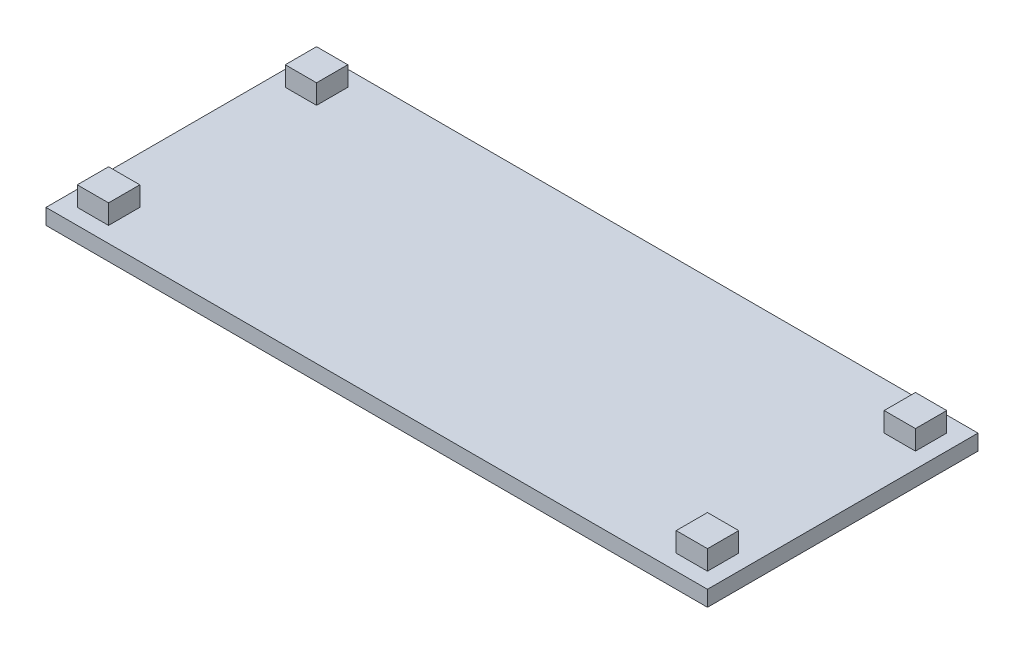
ISO-10303-21;
HEADER;
FILE_DESCRIPTION(('STEP AP214'),'2;1');
FILE_NAME('part.step','',(''),(''),'','','');
FILE_SCHEMA(('AUTOMOTIVE_DESIGN { 1 0 10303 214 1 1 1 1 }'));
ENDSEC;
DATA;
#1=APPLICATION_CONTEXT('core data for automotive mechanical design processes');
#2=APPLICATION_PROTOCOL_DEFINITION('international standard','automotive_design',2000,#1);
#3=PRODUCT_CONTEXT('',#1,'mechanical');
#4=PRODUCT('Part','Part','',(#3));
#5=PRODUCT_RELATED_PRODUCT_CATEGORY('part','',(#4));
#6=PRODUCT_DEFINITION_FORMATION('','',#4);
#7=PRODUCT_DEFINITION_CONTEXT('part definition',#1,'design');
#8=PRODUCT_DEFINITION('design','',#6,#7);
#9=PRODUCT_DEFINITION_SHAPE('','',#8);
#10=(LENGTH_UNIT() NAMED_UNIT(*) SI_UNIT(.MILLI.,.METRE.));
#11=(NAMED_UNIT(*) PLANE_ANGLE_UNIT() SI_UNIT($,.RADIAN.));
#12=(NAMED_UNIT(*) SI_UNIT($,.STERADIAN.) SOLID_ANGLE_UNIT());
#13=UNCERTAINTY_MEASURE_WITH_UNIT(LENGTH_MEASURE(1.E-05),#10,'distance_accuracy_value','');
#14=(GEOMETRIC_REPRESENTATION_CONTEXT(3) GLOBAL_UNCERTAINTY_ASSIGNED_CONTEXT((#13)) GLOBAL_UNIT_ASSIGNED_CONTEXT((#10,
#11,#12)) REPRESENTATION_CONTEXT('',''));
#15=CARTESIAN_POINT('',(0.,0.,0.));
#16=DIRECTION('',(0.,0.,1.));
#17=DIRECTION('',(1.,0.,0.));
#18=AXIS2_PLACEMENT_3D('',#15,#16,#17);
#19=CARTESIAN_POINT('',(0.,2.,0.));
#20=DIRECTION('',(0.,-1.,0.));
#21=DIRECTION('',(0.,0.,-1.));
#22=AXIS2_PLACEMENT_3D('',#19,#20,#21);
#23=PLANE('',#22);
#24=DIRECTION('',(0.,0.,-1.));
#25=VECTOR('',#24,1.);
#26=CARTESIAN_POINT('',(-36.3,2.,0.));
#27=LINE('',#26,#25);
#28=CARTESIAN_POINT('',(-36.3,2.,-11.3));
#29=VERTEX_POINT('',#28);
#30=CARTESIAN_POINT('',(-36.3,2.,-15.3));
#31=VERTEX_POINT('',#30);
#32=EDGE_CURVE('E297',#29,#31,#27,.T.);
#33=ORIENTED_EDGE('',*,*,#32,.F.);
#34=DIRECTION('',(1.,0.,0.));
#35=VECTOR('',#34,1.);
#36=CARTESIAN_POINT('',(0.,2.,-11.3));
#37=LINE('',#36,#35);
#38=CARTESIAN_POINT('',(-40.3,2.,-11.3));
#39=VERTEX_POINT('',#38);
#40=EDGE_CURVE('E288',#39,#29,#37,.T.);
#41=ORIENTED_EDGE('',*,*,#40,.F.);
#42=DIRECTION('',(0.,0.,1.));
#43=VECTOR('',#42,1.);
#44=CARTESIAN_POINT('',(-40.3,2.,0.));
#45=LINE('',#44,#43);
#46=CARTESIAN_POINT('',(-40.3,2.,-15.3));
#47=VERTEX_POINT('',#46);
#48=EDGE_CURVE('E295',#47,#39,#45,.T.);
#49=ORIENTED_EDGE('',*,*,#48,.F.);
#50=DIRECTION('',(-1.,0.,0.));
#51=VECTOR('',#50,1.);
#52=CARTESIAN_POINT('',(0.,2.,-15.3));
#53=LINE('',#52,#51);
#54=EDGE_CURVE('E293',#31,#47,#53,.T.);
#55=ORIENTED_EDGE('',*,*,#54,.F.);
#56=EDGE_LOOP('',(#33,#41,#49,#55));
#57=FACE_BOUND('',#56,.T.);
#58=DIRECTION('',(0.,0.,1.));
#59=VECTOR('',#58,1.);
#60=CARTESIAN_POINT('',(36.3,2.,0.));
#61=LINE('',#60,#59);
#62=CARTESIAN_POINT('',(36.3,2.,-15.3));
#63=VERTEX_POINT('',#62);
#64=CARTESIAN_POINT('',(36.3,2.,-11.3));
#65=VERTEX_POINT('',#64);
#66=EDGE_CURVE('E280',#63,#65,#61,.T.);
#67=ORIENTED_EDGE('',*,*,#66,.F.);
#68=DIRECTION('',(-1.,0.,0.));
#69=VECTOR('',#68,1.);
#70=CARTESIAN_POINT('',(0.,2.,-15.3));
#71=LINE('',#70,#69);
#72=CARTESIAN_POINT('',(40.3,2.,-15.3));
#73=VERTEX_POINT('',#72);
#74=EDGE_CURVE('E268',#73,#63,#71,.T.);
#75=ORIENTED_EDGE('',*,*,#74,.F.);
#76=DIRECTION('',(0.,0.,-1.));
#77=VECTOR('',#76,1.);
#78=CARTESIAN_POINT('',(40.3,2.,0.));
#79=LINE('',#78,#77);
#80=CARTESIAN_POINT('',(40.3,2.,-11.3));
#81=VERTEX_POINT('',#80);
#82=EDGE_CURVE('E271',#81,#73,#79,.T.);
#83=ORIENTED_EDGE('',*,*,#82,.F.);
#84=DIRECTION('',(1.,0.,0.));
#85=VECTOR('',#84,1.);
#86=CARTESIAN_POINT('',(0.,2.,-11.3));
#87=LINE('',#86,#85);
#88=EDGE_CURVE('E273',#65,#81,#87,.T.);
#89=ORIENTED_EDGE('',*,*,#88,.F.);
#90=EDGE_LOOP('',(#67,#75,#83,#89));
#91=FACE_BOUND('',#90,.T.);
#92=DIRECTION('',(0.,0.,-1.));
#93=VECTOR('',#92,1.);
#94=CARTESIAN_POINT('',(42.3,2.,17.3));
#95=LINE('',#94,#93);
#96=CARTESIAN_POINT('',(42.3,2.,17.3));
#97=VERTEX_POINT('',#96);
#98=CARTESIAN_POINT('',(42.3,2.,-17.3));
#99=VERTEX_POINT('',#98);
#100=EDGE_CURVE('E310',#97,#99,#95,.T.);
#101=ORIENTED_EDGE('',*,*,#100,.T.);
#102=DIRECTION('',(-1.,0.,0.));
#103=VECTOR('',#102,1.);
#104=CARTESIAN_POINT('',(-42.3,2.,-17.3));
#105=LINE('',#104,#103);
#106=CARTESIAN_POINT('',(-42.3,2.,-17.3));
#107=VERTEX_POINT('',#106);
#108=EDGE_CURVE('E315',#99,#107,#105,.T.);
#109=ORIENTED_EDGE('',*,*,#108,.T.);
#110=DIRECTION('',(0.,0.,1.));
#111=VECTOR('',#110,1.);
#112=CARTESIAN_POINT('',(-42.3,2.,17.3));
#113=LINE('',#112,#111);
#114=CARTESIAN_POINT('',(-42.3,2.,17.3));
#115=VERTEX_POINT('',#114);
#116=EDGE_CURVE('E312',#107,#115,#113,.T.);
#117=ORIENTED_EDGE('',*,*,#116,.T.);
#118=DIRECTION('',(1.,0.,0.));
#119=VECTOR('',#118,1.);
#120=CARTESIAN_POINT('',(-42.3,2.,17.3));
#121=LINE('',#120,#119);
#122=EDGE_CURVE('E320',#115,#97,#121,.T.);
#123=ORIENTED_EDGE('',*,*,#122,.T.);
#124=EDGE_LOOP('',(#101,#109,#117,#123));
#125=FACE_BOUND('',#124,.T.);
#126=DIRECTION('',(0.,0.,-1.));
#127=VECTOR('',#126,1.);
#128=CARTESIAN_POINT('',(-36.3,2.,0.));
#129=LINE('',#128,#127);
#130=CARTESIAN_POINT('',(-36.3,2.,15.3));
#131=VERTEX_POINT('',#130);
#132=CARTESIAN_POINT('',(-36.3,2.,11.3));
#133=VERTEX_POINT('',#132);
#134=EDGE_CURVE('E290',#131,#133,#129,.T.);
#135=ORIENTED_EDGE('',*,*,#134,.F.);
#136=DIRECTION('',(1.,0.,0.));
#137=VECTOR('',#136,1.);
#138=CARTESIAN_POINT('',(0.,2.,15.3));
#139=LINE('',#138,#137);
#140=CARTESIAN_POINT('',(-40.3,2.,15.3));
#141=VERTEX_POINT('',#140);
#142=EDGE_CURVE('E195',#141,#131,#139,.T.);
#143=ORIENTED_EDGE('',*,*,#142,.F.);
#144=DIRECTION('',(0.,0.,1.));
#145=VECTOR('',#144,1.);
#146=CARTESIAN_POINT('',(-40.3,2.,0.));
#147=LINE('',#146,#145);
#148=CARTESIAN_POINT('',(-40.3,2.,11.3));
#149=VERTEX_POINT('',#148);
#150=EDGE_CURVE('E283',#149,#141,#147,.T.);
#151=ORIENTED_EDGE('',*,*,#150,.F.);
#152=DIRECTION('',(-1.,0.,0.));
#153=VECTOR('',#152,1.);
#154=CARTESIAN_POINT('',(0.,2.,11.3));
#155=LINE('',#154,#153);
#156=EDGE_CURVE('E285',#133,#149,#155,.T.);
#157=ORIENTED_EDGE('',*,*,#156,.F.);
#158=EDGE_LOOP('',(#135,#143,#151,#157));
#159=FACE_BOUND('',#158,.T.);
#160=DIRECTION('',(0.,0.,1.));
#161=VECTOR('',#160,1.);
#162=CARTESIAN_POINT('',(36.3,2.,0.));
#163=LINE('',#162,#161);
#164=CARTESIAN_POINT('',(36.3,2.,11.3));
#165=VERTEX_POINT('',#164);
#166=CARTESIAN_POINT('',(36.3,2.,15.3));
#167=VERTEX_POINT('',#166);
#168=EDGE_CURVE('E308',#165,#167,#163,.T.);
#169=ORIENTED_EDGE('',*,*,#168,.F.);
#170=DIRECTION('',(-1.,0.,0.));
#171=VECTOR('',#170,1.);
#172=CARTESIAN_POINT('',(0.,2.,11.3));
#173=LINE('',#172,#171);
#174=CARTESIAN_POINT('',(40.3,2.,11.3));
#175=VERTEX_POINT('',#174);
#176=EDGE_CURVE('E301',#175,#165,#173,.T.);
#177=ORIENTED_EDGE('',*,*,#176,.F.);
#178=DIRECTION('',(0.,0.,-1.));
#179=VECTOR('',#178,1.);
#180=CARTESIAN_POINT('',(40.3,2.,0.));
#181=LINE('',#180,#179);
#182=CARTESIAN_POINT('',(40.3,2.,15.3));
#183=VERTEX_POINT('',#182);
#184=EDGE_CURVE('E63',#183,#175,#181,.T.);
#185=ORIENTED_EDGE('',*,*,#184,.F.);
#186=DIRECTION('',(1.,0.,0.));
#187=VECTOR('',#186,1.);
#188=CARTESIAN_POINT('',(0.,2.,15.3));
#189=LINE('',#188,#187);
#190=EDGE_CURVE('E57',#167,#183,#189,.T.);
#191=ORIENTED_EDGE('',*,*,#190,.F.);
#192=EDGE_LOOP('',(#169,#177,#185,#191));
#193=FACE_BOUND('',#192,.T.);
#194=ADVANCED_FACE('F41',(#57,#91,#125,#159,#193),#23,.F.);
#195=CARTESIAN_POINT('',(42.3,2.,17.3));
#196=DIRECTION('',(-1.,0.,0.));
#197=DIRECTION('',(0.,0.,1.));
#198=AXIS2_PLACEMENT_3D('',#195,#196,#197);
#199=PLANE('',#198);
#200=DIRECTION('',(0.,0.,-1.));
#201=VECTOR('',#200,1.);
#202=CARTESIAN_POINT('',(42.3,0.,17.3));
#203=LINE('',#202,#201);
#204=CARTESIAN_POINT('',(42.3,0.,17.3));
#205=VERTEX_POINT('',#204);
#206=CARTESIAN_POINT('',(42.3,0.,-17.3));
#207=VERTEX_POINT('',#206);
#208=EDGE_CURVE('E306',#205,#207,#203,.T.);
#209=ORIENTED_EDGE('',*,*,#208,.T.);
#210=DIRECTION('',(0.,-1.,0.));
#211=VECTOR('',#210,1.);
#212=CARTESIAN_POINT('',(42.3,2.,-17.3));
#213=LINE('',#212,#211);
#214=EDGE_CURVE('E11',#99,#207,#213,.T.);
#215=ORIENTED_EDGE('',*,*,#214,.F.);
#216=ORIENTED_EDGE('',*,*,#100,.F.);
#217=DIRECTION('',(0.,-1.,0.));
#218=VECTOR('',#217,1.);
#219=CARTESIAN_POINT('',(42.3,2.,17.3));
#220=LINE('',#219,#218);
#221=EDGE_CURVE('E317',#97,#205,#220,.T.);
#222=ORIENTED_EDGE('',*,*,#221,.T.);
#223=EDGE_LOOP('',(#209,#215,#216,#222));
#224=FACE_BOUND('',#223,.T.);
#225=ADVANCED_FACE('F43',(#224),#199,.F.);
#226=CARTESIAN_POINT('',(-42.3,2.,-17.3));
#227=DIRECTION('',(0.,0.,1.));
#228=DIRECTION('',(1.,0.,0.));
#229=AXIS2_PLACEMENT_3D('',#226,#227,#228);
#230=PLANE('',#229);
#231=DIRECTION('',(-1.,0.,0.));
#232=VECTOR('',#231,1.);
#233=CARTESIAN_POINT('',(-42.3,0.,-17.3));
#234=LINE('',#233,#232);
#235=CARTESIAN_POINT('',(-42.3,0.,-17.3));
#236=VERTEX_POINT('',#235);
#237=EDGE_CURVE('E325',#207,#236,#234,.T.);
#238=ORIENTED_EDGE('',*,*,#237,.T.);
#239=DIRECTION('',(0.,-1.,0.));
#240=VECTOR('',#239,1.);
#241=CARTESIAN_POINT('',(-42.3,2.,-17.3));
#242=LINE('',#241,#240);
#243=EDGE_CURVE('E47',#107,#236,#242,.T.);
#244=ORIENTED_EDGE('',*,*,#243,.F.);
#245=ORIENTED_EDGE('',*,*,#108,.F.);
#246=ORIENTED_EDGE('',*,*,#214,.T.);
#247=EDGE_LOOP('',(#238,#244,#245,#246));
#248=FACE_BOUND('',#247,.T.);
#249=ADVANCED_FACE('F354',(#248),#230,.F.);
#250=CARTESIAN_POINT('',(-42.3,2.,17.3));
#251=DIRECTION('',(1.,0.,0.));
#252=DIRECTION('',(0.,0.,-1.));
#253=AXIS2_PLACEMENT_3D('',#250,#251,#252);
#254=PLANE('',#253);
#255=DIRECTION('',(0.,0.,1.));
#256=VECTOR('',#255,1.);
#257=CARTESIAN_POINT('',(-42.3,0.,17.3));
#258=LINE('',#257,#256);
#259=CARTESIAN_POINT('',(-42.3,0.,17.3));
#260=VERTEX_POINT('',#259);
#261=EDGE_CURVE('E322',#236,#260,#258,.T.);
#262=ORIENTED_EDGE('',*,*,#261,.T.);
#263=DIRECTION('',(0.,-1.,0.));
#264=VECTOR('',#263,1.);
#265=CARTESIAN_POINT('',(-42.3,2.,17.3));
#266=LINE('',#265,#264);
#267=EDGE_CURVE('E328',#115,#260,#266,.T.);
#268=ORIENTED_EDGE('',*,*,#267,.F.);
#269=ORIENTED_EDGE('',*,*,#116,.F.);
#270=ORIENTED_EDGE('',*,*,#243,.T.);
#271=EDGE_LOOP('',(#262,#268,#269,#270));
#272=FACE_BOUND('',#271,.T.);
#273=ADVANCED_FACE('F338',(#272),#254,.F.);
#274=CARTESIAN_POINT('',(-42.3,2.,17.3));
#275=DIRECTION('',(0.,0.,-1.));
#276=DIRECTION('',(-1.,0.,0.));
#277=AXIS2_PLACEMENT_3D('',#274,#275,#276);
#278=PLANE('',#277);
#279=DIRECTION('',(1.,0.,0.));
#280=VECTOR('',#279,1.);
#281=CARTESIAN_POINT('',(-42.3,0.,17.3));
#282=LINE('',#281,#280);
#283=EDGE_CURVE('E311',#260,#205,#282,.T.);
#284=ORIENTED_EDGE('',*,*,#283,.T.);
#285=ORIENTED_EDGE('',*,*,#221,.F.);
#286=ORIENTED_EDGE('',*,*,#122,.F.);
#287=ORIENTED_EDGE('',*,*,#267,.T.);
#288=EDGE_LOOP('',(#284,#285,#286,#287));
#289=FACE_BOUND('',#288,.T.);
#290=ADVANCED_FACE('F344',(#289),#278,.F.);
#291=CARTESIAN_POINT('',(0.,0.,0.));
#292=DIRECTION('',(0.,-1.,0.));
#293=DIRECTION('',(0.,0.,-1.));
#294=AXIS2_PLACEMENT_3D('',#291,#292,#293);
#295=PLANE('',#294);
#296=ORIENTED_EDGE('',*,*,#208,.F.);
#297=ORIENTED_EDGE('',*,*,#283,.F.);
#298=ORIENTED_EDGE('',*,*,#261,.F.);
#299=ORIENTED_EDGE('',*,*,#237,.F.);
#300=EDGE_LOOP('',(#296,#297,#298,#299));
#301=FACE_BOUND('',#300,.T.);
#302=ADVANCED_FACE('F345',(#301),#295,.T.);
#303=CARTESIAN_POINT('',(36.3,4.5,-11.3));
#304=DIRECTION('',(1.,0.,0.));
#305=DIRECTION('',(0.,0.,-1.));
#306=AXIS2_PLACEMENT_3D('',#303,#304,#305);
#307=PLANE('',#306);
#308=DIRECTION('',(0.,-1.,0.));
#309=VECTOR('',#308,1.);
#310=CARTESIAN_POINT('',(36.3,4.5,-15.3));
#311=LINE('',#310,#309);
#312=CARTESIAN_POINT('',(36.3,4.5,-15.3));
#313=VERTEX_POINT('',#312);
#314=EDGE_CURVE('E258',#313,#63,#311,.T.);
#315=ORIENTED_EDGE('',*,*,#314,.T.);
#316=ORIENTED_EDGE('',*,*,#66,.T.);
#317=DIRECTION('',(0.,-1.,0.));
#318=VECTOR('',#317,1.);
#319=CARTESIAN_POINT('',(36.3,4.5,-11.3));
#320=LINE('',#319,#318);
#321=CARTESIAN_POINT('',(36.3,4.5,-11.3));
#322=VERTEX_POINT('',#321);
#323=EDGE_CURVE('E264',#322,#65,#320,.T.);
#324=ORIENTED_EDGE('',*,*,#323,.F.);
#325=DIRECTION('',(0.,0.,1.));
#326=VECTOR('',#325,1.);
#327=CARTESIAN_POINT('',(36.3,4.5,-11.3));
#328=LINE('',#327,#326);
#329=EDGE_CURVE('E226',#313,#322,#328,.T.);
#330=ORIENTED_EDGE('',*,*,#329,.F.);
#331=EDGE_LOOP('',(#315,#316,#324,#330));
#332=FACE_BOUND('',#331,.T.);
#333=ADVANCED_FACE('F369',(#332),#307,.F.);
#334=CARTESIAN_POINT('',(36.3,4.5,-11.3));
#335=DIRECTION('',(0.,0.,-1.));
#336=DIRECTION('',(-1.,0.,0.));
#337=AXIS2_PLACEMENT_3D('',#334,#335,#336);
#338=PLANE('',#337);
#339=ORIENTED_EDGE('',*,*,#323,.T.);
#340=ORIENTED_EDGE('',*,*,#88,.T.);
#341=DIRECTION('',(0.,-1.,0.));
#342=VECTOR('',#341,1.);
#343=CARTESIAN_POINT('',(40.3,4.5,-11.3));
#344=LINE('',#343,#342);
#345=CARTESIAN_POINT('',(40.3,4.5,-11.3));
#346=VERTEX_POINT('',#345);
#347=EDGE_CURVE('E265',#346,#81,#344,.T.);
#348=ORIENTED_EDGE('',*,*,#347,.F.);
#349=DIRECTION('',(1.,0.,0.));
#350=VECTOR('',#349,1.);
#351=CARTESIAN_POINT('',(36.3,4.5,-11.3));
#352=LINE('',#351,#350);
#353=EDGE_CURVE('E249',#322,#346,#352,.T.);
#354=ORIENTED_EDGE('',*,*,#353,.F.);
#355=EDGE_LOOP('',(#339,#340,#348,#354));
#356=FACE_BOUND('',#355,.T.);
#357=ADVANCED_FACE('F407',(#356),#338,.F.);
#358=CARTESIAN_POINT('',(40.3,4.5,-11.3));
#359=DIRECTION('',(-1.,0.,0.));
#360=DIRECTION('',(0.,0.,1.));
#361=AXIS2_PLACEMENT_3D('',#358,#359,#360);
#362=PLANE('',#361);
#363=ORIENTED_EDGE('',*,*,#347,.T.);
#364=ORIENTED_EDGE('',*,*,#82,.T.);
#365=DIRECTION('',(0.,-1.,0.));
#366=VECTOR('',#365,1.);
#367=CARTESIAN_POINT('',(40.3,4.5,-15.3));
#368=LINE('',#367,#366);
#369=CARTESIAN_POINT('',(40.3,4.5,-15.3));
#370=VERTEX_POINT('',#369);
#371=EDGE_CURVE('E259',#370,#73,#368,.T.);
#372=ORIENTED_EDGE('',*,*,#371,.F.);
#373=DIRECTION('',(0.,0.,-1.));
#374=VECTOR('',#373,1.);
#375=CARTESIAN_POINT('',(40.3,4.5,-11.3));
#376=LINE('',#375,#374);
#377=EDGE_CURVE('E252',#346,#370,#376,.T.);
#378=ORIENTED_EDGE('',*,*,#377,.F.);
#379=EDGE_LOOP('',(#363,#364,#372,#378));
#380=FACE_BOUND('',#379,.T.);
#381=ADVANCED_FACE('F418',(#380),#362,.F.);
#382=CARTESIAN_POINT('',(36.3,4.5,-15.3));
#383=DIRECTION('',(0.,0.,1.));
#384=DIRECTION('',(1.,0.,0.));
#385=AXIS2_PLACEMENT_3D('',#382,#383,#384);
#386=PLANE('',#385);
#387=ORIENTED_EDGE('',*,*,#371,.T.);
#388=ORIENTED_EDGE('',*,*,#74,.T.);
#389=ORIENTED_EDGE('',*,*,#314,.F.);
#390=DIRECTION('',(-1.,0.,0.));
#391=VECTOR('',#390,1.);
#392=CARTESIAN_POINT('',(36.3,4.5,-15.3));
#393=LINE('',#392,#391);
#394=EDGE_CURVE('E255',#370,#313,#393,.T.);
#395=ORIENTED_EDGE('',*,*,#394,.F.);
#396=EDGE_LOOP('',(#387,#388,#389,#395));
#397=FACE_BOUND('',#396,.T.);
#398=ADVANCED_FACE('F424',(#397),#386,.F.);
#399=CARTESIAN_POINT('',(0.,4.5,0.));
#400=DIRECTION('',(0.,-1.,0.));
#401=DIRECTION('',(0.,0.,-1.));
#402=AXIS2_PLACEMENT_3D('',#399,#400,#401);
#403=PLANE('',#402);
#404=ORIENTED_EDGE('',*,*,#329,.T.);
#405=ORIENTED_EDGE('',*,*,#353,.T.);
#406=ORIENTED_EDGE('',*,*,#377,.T.);
#407=ORIENTED_EDGE('',*,*,#394,.T.);
#408=EDGE_LOOP('',(#404,#405,#406,#407));
#409=FACE_BOUND('',#408,.T.);
#410=ADVANCED_FACE('F433',(#409),#403,.F.);
#411=CARTESIAN_POINT('',(-36.3,4.5,11.3));
#412=DIRECTION('',(-1.,0.,0.));
#413=DIRECTION('',(0.,0.,1.));
#414=AXIS2_PLACEMENT_3D('',#411,#412,#413);
#415=PLANE('',#414);
#416=DIRECTION('',(0.,-1.,0.));
#417=VECTOR('',#416,1.);
#418=CARTESIAN_POINT('',(-36.3,4.5,15.3));
#419=LINE('',#418,#417);
#420=CARTESIAN_POINT('',(-36.3,4.5,15.3));
#421=VERTEX_POINT('',#420);
#422=EDGE_CURVE('E189',#421,#131,#419,.T.);
#423=ORIENTED_EDGE('',*,*,#422,.T.);
#424=ORIENTED_EDGE('',*,*,#134,.T.);
#425=DIRECTION('',(0.,-1.,0.));
#426=VECTOR('',#425,1.);
#427=CARTESIAN_POINT('',(-36.3,4.5,11.3));
#428=LINE('',#427,#426);
#429=CARTESIAN_POINT('',(-36.3,4.5,11.3));
#430=VERTEX_POINT('',#429);
#431=EDGE_CURVE('E200',#430,#133,#428,.T.);
#432=ORIENTED_EDGE('',*,*,#431,.F.);
#433=DIRECTION('',(0.,0.,-1.));
#434=VECTOR('',#433,1.);
#435=CARTESIAN_POINT('',(-36.3,4.5,11.3));
#436=LINE('',#435,#434);
#437=EDGE_CURVE('E179',#421,#430,#436,.T.);
#438=ORIENTED_EDGE('',*,*,#437,.F.);
#439=EDGE_LOOP('',(#423,#424,#432,#438));
#440=FACE_BOUND('',#439,.T.);
#441=ADVANCED_FACE('F197',(#440),#415,.F.);
#442=CARTESIAN_POINT('',(-36.3,4.5,11.3));
#443=DIRECTION('',(0.,0.,1.));
#444=DIRECTION('',(1.,0.,0.));
#445=AXIS2_PLACEMENT_3D('',#442,#443,#444);
#446=PLANE('',#445);
#447=ORIENTED_EDGE('',*,*,#431,.T.);
#448=ORIENTED_EDGE('',*,*,#156,.T.);
#449=DIRECTION('',(0.,-1.,0.));
#450=VECTOR('',#449,1.);
#451=CARTESIAN_POINT('',(-40.3,4.5,11.3));
#452=LINE('',#451,#450);
#453=CARTESIAN_POINT('',(-40.3,4.5,11.3));
#454=VERTEX_POINT('',#453);
#455=EDGE_CURVE('E613',#454,#149,#452,.T.);
#456=ORIENTED_EDGE('',*,*,#455,.F.);
#457=DIRECTION('',(-1.,0.,0.));
#458=VECTOR('',#457,1.);
#459=CARTESIAN_POINT('',(-36.3,4.5,11.3));
#460=LINE('',#459,#458);
#461=EDGE_CURVE('E203',#430,#454,#460,.T.);
#462=ORIENTED_EDGE('',*,*,#461,.F.);
#463=EDGE_LOOP('',(#447,#448,#456,#462));
#464=FACE_BOUND('',#463,.T.);
#465=ADVANCED_FACE('F446',(#464),#446,.F.);
#466=CARTESIAN_POINT('',(-40.3,4.5,11.3));
#467=DIRECTION('',(1.,0.,0.));
#468=DIRECTION('',(0.,0.,-1.));
#469=AXIS2_PLACEMENT_3D('',#466,#467,#468);
#470=PLANE('',#469);
#471=ORIENTED_EDGE('',*,*,#455,.T.);
#472=ORIENTED_EDGE('',*,*,#150,.T.);
#473=DIRECTION('',(0.,-1.,0.));
#474=VECTOR('',#473,1.);
#475=CARTESIAN_POINT('',(-40.3,4.5,15.3));
#476=LINE('',#475,#474);
#477=CARTESIAN_POINT('',(-40.3,4.5,15.3));
#478=VERTEX_POINT('',#477);
#479=EDGE_CURVE('E194',#478,#141,#476,.T.);
#480=ORIENTED_EDGE('',*,*,#479,.F.);
#481=DIRECTION('',(0.,0.,1.));
#482=VECTOR('',#481,1.);
#483=CARTESIAN_POINT('',(-40.3,4.5,11.3));
#484=LINE('',#483,#482);
#485=EDGE_CURVE('E181',#454,#478,#484,.T.);
#486=ORIENTED_EDGE('',*,*,#485,.F.);
#487=EDGE_LOOP('',(#471,#472,#480,#486));
#488=FACE_BOUND('',#487,.T.);
#489=ADVANCED_FACE('F456',(#488),#470,.F.);
#490=CARTESIAN_POINT('',(-36.3,4.5,15.3));
#491=DIRECTION('',(0.,0.,-1.));
#492=DIRECTION('',(-1.,0.,0.));
#493=AXIS2_PLACEMENT_3D('',#490,#491,#492);
#494=PLANE('',#493);
#495=ORIENTED_EDGE('',*,*,#479,.T.);
#496=ORIENTED_EDGE('',*,*,#142,.T.);
#497=ORIENTED_EDGE('',*,*,#422,.F.);
#498=DIRECTION('',(1.,0.,0.));
#499=VECTOR('',#498,1.);
#500=CARTESIAN_POINT('',(-36.3,4.5,15.3));
#501=LINE('',#500,#499);
#502=EDGE_CURVE('E176',#478,#421,#501,.T.);
#503=ORIENTED_EDGE('',*,*,#502,.F.);
#504=EDGE_LOOP('',(#495,#496,#497,#503));
#505=FACE_BOUND('',#504,.T.);
#506=ADVANCED_FACE('F191',(#505),#494,.F.);
#507=CARTESIAN_POINT('',(0.,4.5,0.));
#508=DIRECTION('',(0.,-1.,0.));
#509=DIRECTION('',(0.,0.,-1.));
#510=AXIS2_PLACEMENT_3D('',#507,#508,#509);
#511=PLANE('',#510);
#512=ORIENTED_EDGE('',*,*,#437,.T.);
#513=ORIENTED_EDGE('',*,*,#461,.T.);
#514=ORIENTED_EDGE('',*,*,#485,.T.);
#515=ORIENTED_EDGE('',*,*,#502,.T.);
#516=EDGE_LOOP('',(#512,#513,#514,#515));
#517=FACE_BOUND('',#516,.T.);
#518=ADVANCED_FACE('F177',(#517),#511,.F.);
#519=CARTESIAN_POINT('',(-36.3,4.5,-11.3));
#520=DIRECTION('',(-1.,0.,0.));
#521=DIRECTION('',(0.,0.,1.));
#522=AXIS2_PLACEMENT_3D('',#519,#520,#521);
#523=PLANE('',#522);
#524=DIRECTION('',(0.,-1.,0.));
#525=VECTOR('',#524,1.);
#526=CARTESIAN_POINT('',(-36.3,4.5,-11.3));
#527=LINE('',#526,#525);
#528=CARTESIAN_POINT('',(-36.3,4.5,-11.3));
#529=VERTEX_POINT('',#528);
#530=EDGE_CURVE('E240',#529,#29,#527,.T.);
#531=ORIENTED_EDGE('',*,*,#530,.T.);
#532=ORIENTED_EDGE('',*,*,#32,.T.);
#533=DIRECTION('',(0.,-1.,0.));
#534=VECTOR('',#533,1.);
#535=CARTESIAN_POINT('',(-36.3,4.5,-15.3));
#536=LINE('',#535,#534);
#537=CARTESIAN_POINT('',(-36.3,4.5,-15.3));
#538=VERTEX_POINT('',#537);
#539=EDGE_CURVE('E199',#538,#31,#536,.T.);
#540=ORIENTED_EDGE('',*,*,#539,.F.);
#541=DIRECTION('',(0.,0.,-1.));
#542=VECTOR('',#541,1.);
#543=CARTESIAN_POINT('',(-36.3,4.5,-11.3));
#544=LINE('',#543,#542);
#545=EDGE_CURVE('E213',#529,#538,#544,.T.);
#546=ORIENTED_EDGE('',*,*,#545,.F.);
#547=EDGE_LOOP('',(#531,#532,#540,#546));
#548=FACE_BOUND('',#547,.T.);
#549=ADVANCED_FACE('F485',(#548),#523,.F.);
#550=CARTESIAN_POINT('',(-36.3,4.5,-15.3));
#551=DIRECTION('',(0.,0.,1.));
#552=DIRECTION('',(1.,0.,0.));
#553=AXIS2_PLACEMENT_3D('',#550,#551,#552);
#554=PLANE('',#553);
#555=ORIENTED_EDGE('',*,*,#539,.T.);
#556=ORIENTED_EDGE('',*,*,#54,.T.);
#557=DIRECTION('',(0.,-1.,0.));
#558=VECTOR('',#557,1.);
#559=CARTESIAN_POINT('',(-40.3,4.5,-15.3));
#560=LINE('',#559,#558);
#561=CARTESIAN_POINT('',(-40.3,4.5,-15.3));
#562=VERTEX_POINT('',#561);
#563=EDGE_CURVE('E204',#562,#47,#560,.T.);
#564=ORIENTED_EDGE('',*,*,#563,.F.);
#565=DIRECTION('',(-1.,0.,0.));
#566=VECTOR('',#565,1.);
#567=CARTESIAN_POINT('',(-36.3,4.5,-15.3));
#568=LINE('',#567,#566);
#569=EDGE_CURVE('E245',#538,#562,#568,.T.);
#570=ORIENTED_EDGE('',*,*,#569,.F.);
#571=EDGE_LOOP('',(#555,#556,#564,#570));
#572=FACE_BOUND('',#571,.T.);
#573=ADVANCED_FACE('F489',(#572),#554,.F.);
#574=CARTESIAN_POINT('',(-40.3,4.5,-11.3));
#575=DIRECTION('',(1.,0.,0.));
#576=DIRECTION('',(0.,0.,-1.));
#577=AXIS2_PLACEMENT_3D('',#574,#575,#576);
#578=PLANE('',#577);
#579=ORIENTED_EDGE('',*,*,#563,.T.);
#580=ORIENTED_EDGE('',*,*,#48,.T.);
#581=DIRECTION('',(0.,-1.,0.));
#582=VECTOR('',#581,1.);
#583=CARTESIAN_POINT('',(-40.3,4.5,-11.3));
#584=LINE('',#583,#582);
#585=CARTESIAN_POINT('',(-40.3,4.5,-11.3));
#586=VERTEX_POINT('',#585);
#587=EDGE_CURVE('E233',#586,#39,#584,.T.);
#588=ORIENTED_EDGE('',*,*,#587,.F.);
#589=DIRECTION('',(0.,0.,1.));
#590=VECTOR('',#589,1.);
#591=CARTESIAN_POINT('',(-40.3,4.5,-11.3));
#592=LINE('',#591,#590);
#593=EDGE_CURVE('E244',#562,#586,#592,.T.);
#594=ORIENTED_EDGE('',*,*,#593,.F.);
#595=EDGE_LOOP('',(#579,#580,#588,#594));
#596=FACE_BOUND('',#595,.T.);
#597=ADVANCED_FACE('F496',(#596),#578,.F.);
#598=CARTESIAN_POINT('',(-36.3,4.5,-11.3));
#599=DIRECTION('',(0.,0.,-1.));
#600=DIRECTION('',(-1.,0.,0.));
#601=AXIS2_PLACEMENT_3D('',#598,#599,#600);
#602=PLANE('',#601);
#603=ORIENTED_EDGE('',*,*,#587,.T.);
#604=ORIENTED_EDGE('',*,*,#40,.T.);
#605=ORIENTED_EDGE('',*,*,#530,.F.);
#606=DIRECTION('',(1.,0.,0.));
#607=VECTOR('',#606,1.);
#608=CARTESIAN_POINT('',(-36.3,4.5,-11.3));
#609=LINE('',#608,#607);
#610=EDGE_CURVE('E238',#586,#529,#609,.T.);
#611=ORIENTED_EDGE('',*,*,#610,.F.);
#612=EDGE_LOOP('',(#603,#604,#605,#611));
#613=FACE_BOUND('',#612,.T.);
#614=ADVANCED_FACE('F507',(#613),#602,.F.);
#615=CARTESIAN_POINT('',(0.,4.5,0.));
#616=DIRECTION('',(0.,1.,0.));
#617=DIRECTION('',(0.,0.,1.));
#618=AXIS2_PLACEMENT_3D('',#615,#616,#617);
#619=PLANE('',#618);
#620=ORIENTED_EDGE('',*,*,#545,.T.);
#621=ORIENTED_EDGE('',*,*,#569,.T.);
#622=ORIENTED_EDGE('',*,*,#593,.T.);
#623=ORIENTED_EDGE('',*,*,#610,.T.);
#624=EDGE_LOOP('',(#620,#621,#622,#623));
#625=FACE_BOUND('',#624,.T.);
#626=ADVANCED_FACE('F519',(#625),#619,.T.);
#627=CARTESIAN_POINT('',(36.3,4.5,11.3));
#628=DIRECTION('',(1.,0.,0.));
#629=DIRECTION('',(0.,0.,-1.));
#630=AXIS2_PLACEMENT_3D('',#627,#628,#629);
#631=PLANE('',#630);
#632=DIRECTION('',(0.,-1.,0.));
#633=VECTOR('',#632,1.);
#634=CARTESIAN_POINT('',(36.3,4.5,11.3));
#635=LINE('',#634,#633);
#636=CARTESIAN_POINT('',(36.3,4.5,11.3));
#637=VERTEX_POINT('',#636);
#638=EDGE_CURVE('E218',#637,#165,#635,.T.);
#639=ORIENTED_EDGE('',*,*,#638,.T.);
#640=ORIENTED_EDGE('',*,*,#168,.T.);
#641=DIRECTION('',(0.,-1.,0.));
#642=VECTOR('',#641,1.);
#643=CARTESIAN_POINT('',(36.3,4.5,15.3));
#644=LINE('',#643,#642);
#645=CARTESIAN_POINT('',(36.3,4.5,15.3));
#646=VERTEX_POINT('',#645);
#647=EDGE_CURVE('E207',#646,#167,#644,.T.);
#648=ORIENTED_EDGE('',*,*,#647,.F.);
#649=DIRECTION('',(0.,0.,1.));
#650=VECTOR('',#649,1.);
#651=CARTESIAN_POINT('',(36.3,4.5,11.3));
#652=LINE('',#651,#650);
#653=EDGE_CURVE('E227',#637,#646,#652,.T.);
#654=ORIENTED_EDGE('',*,*,#653,.F.);
#655=EDGE_LOOP('',(#639,#640,#648,#654));
#656=FACE_BOUND('',#655,.T.);
#657=ADVANCED_FACE('F528',(#656),#631,.F.);
#658=CARTESIAN_POINT('',(36.3,4.5,15.3));
#659=DIRECTION('',(0.,0.,-1.));
#660=DIRECTION('',(-1.,0.,0.));
#661=AXIS2_PLACEMENT_3D('',#658,#659,#660);
#662=PLANE('',#661);
#663=ORIENTED_EDGE('',*,*,#647,.T.);
#664=ORIENTED_EDGE('',*,*,#190,.T.);
#665=DIRECTION('',(0.,-1.,0.));
#666=VECTOR('',#665,1.);
#667=CARTESIAN_POINT('',(40.3,4.5,15.3));
#668=LINE('',#667,#666);
#669=CARTESIAN_POINT('',(40.3,4.5,15.3));
#670=VERTEX_POINT('',#669);
#671=EDGE_CURVE('E215',#670,#183,#668,.T.);
#672=ORIENTED_EDGE('',*,*,#671,.F.);
#673=DIRECTION('',(1.,0.,0.));
#674=VECTOR('',#673,1.);
#675=CARTESIAN_POINT('',(36.3,4.5,15.3));
#676=LINE('',#675,#674);
#677=EDGE_CURVE('E228',#646,#670,#676,.T.);
#678=ORIENTED_EDGE('',*,*,#677,.F.);
#679=EDGE_LOOP('',(#663,#664,#672,#678));
#680=FACE_BOUND('',#679,.T.);
#681=ADVANCED_FACE('F532',(#680),#662,.F.);
#682=CARTESIAN_POINT('',(40.3,4.5,11.3));
#683=DIRECTION('',(-1.,0.,0.));
#684=DIRECTION('',(0.,0.,1.));
#685=AXIS2_PLACEMENT_3D('',#682,#683,#684);
#686=PLANE('',#685);
#687=ORIENTED_EDGE('',*,*,#671,.T.);
#688=ORIENTED_EDGE('',*,*,#184,.T.);
#689=DIRECTION('',(0.,-1.,0.));
#690=VECTOR('',#689,1.);
#691=CARTESIAN_POINT('',(40.3,4.5,11.3));
#692=LINE('',#691,#690);
#693=CARTESIAN_POINT('',(40.3,4.5,11.3));
#694=VERTEX_POINT('',#693);
#695=EDGE_CURVE('E216',#694,#175,#692,.T.);
#696=ORIENTED_EDGE('',*,*,#695,.F.);
#697=DIRECTION('',(0.,0.,-1.));
#698=VECTOR('',#697,1.);
#699=CARTESIAN_POINT('',(40.3,4.5,11.3));
#700=LINE('',#699,#698);
#701=EDGE_CURVE('E221',#670,#694,#700,.T.);
#702=ORIENTED_EDGE('',*,*,#701,.F.);
#703=EDGE_LOOP('',(#687,#688,#696,#702));
#704=FACE_BOUND('',#703,.T.);
#705=ADVANCED_FACE('F542',(#704),#686,.F.);
#706=CARTESIAN_POINT('',(36.3,4.5,11.3));
#707=DIRECTION('',(0.,0.,1.));
#708=DIRECTION('',(1.,0.,0.));
#709=AXIS2_PLACEMENT_3D('',#706,#707,#708);
#710=PLANE('',#709);
#711=ORIENTED_EDGE('',*,*,#695,.T.);
#712=ORIENTED_EDGE('',*,*,#176,.T.);
#713=ORIENTED_EDGE('',*,*,#638,.F.);
#714=DIRECTION('',(-1.,0.,0.));
#715=VECTOR('',#714,1.);
#716=CARTESIAN_POINT('',(36.3,4.5,11.3));
#717=LINE('',#716,#715);
#718=EDGE_CURVE('E225',#694,#637,#717,.T.);
#719=ORIENTED_EDGE('',*,*,#718,.F.);
#720=EDGE_LOOP('',(#711,#712,#713,#719));
#721=FACE_BOUND('',#720,.T.);
#722=ADVANCED_FACE('F554',(#721),#710,.F.);
#723=CARTESIAN_POINT('',(0.,4.5,0.));
#724=DIRECTION('',(0.,1.,0.));
#725=DIRECTION('',(0.,0.,1.));
#726=AXIS2_PLACEMENT_3D('',#723,#724,#725);
#727=PLANE('',#726);
#728=ORIENTED_EDGE('',*,*,#653,.T.);
#729=ORIENTED_EDGE('',*,*,#677,.T.);
#730=ORIENTED_EDGE('',*,*,#701,.T.);
#731=ORIENTED_EDGE('',*,*,#718,.T.);
#732=EDGE_LOOP('',(#728,#729,#730,#731));
#733=FACE_BOUND('',#732,.T.);
#734=ADVANCED_FACE('F565',(#733),#727,.T.);
#735=CLOSED_SHELL('',(#194,#225,#249,#273,#290,#302,#333,#357,#381,#398,#410,#441,#465,#489,
#506,#518,#549,#573,#597,#614,#626,#657,#681,#705,#722,#734));
#736=MANIFOLD_SOLID_BREP('B2',#735);
#737=ADVANCED_BREP_SHAPE_REPRESENTATION('',(#18,#736),#14);
#738=SHAPE_DEFINITION_REPRESENTATION(#9,#737);
ENDSEC;
END-ISO-10303-21;
